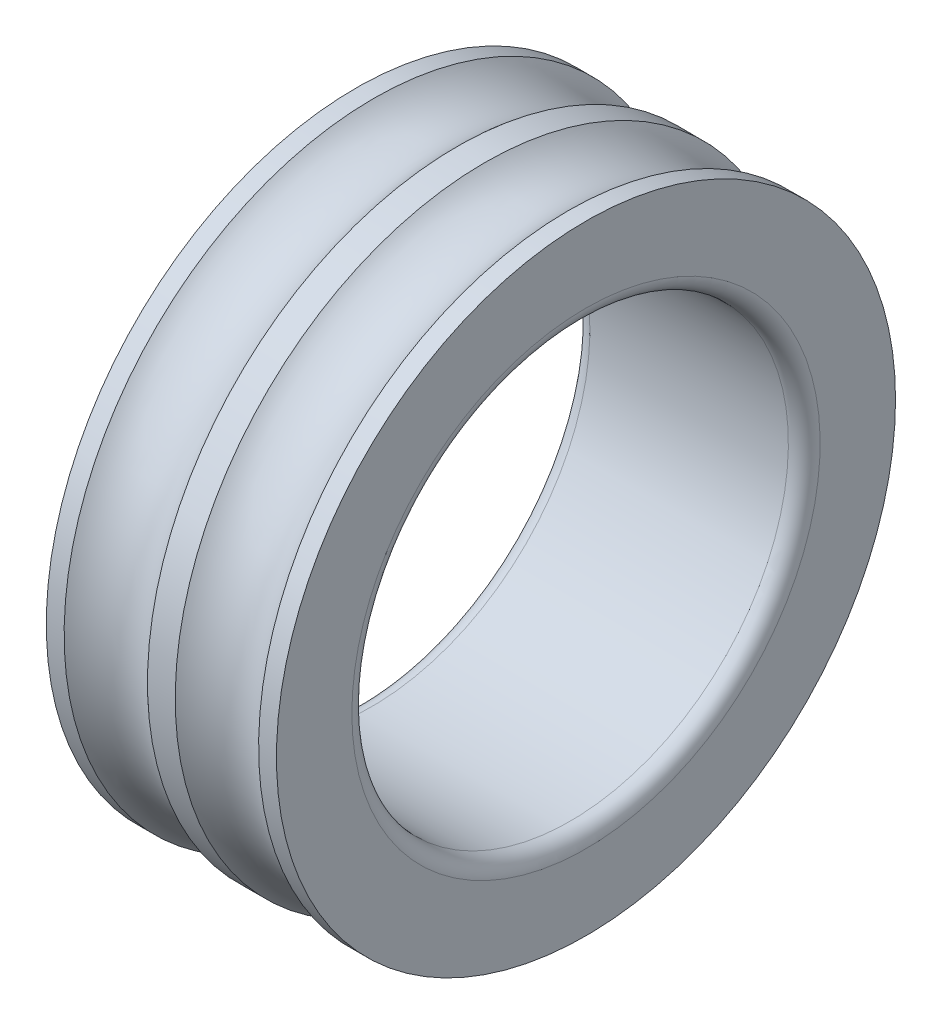
ISO-10303-21;
HEADER;
FILE_DESCRIPTION(('STEP AP214'),'2;1');
FILE_NAME('part.step','',(''),(''),'','','');
FILE_SCHEMA(('AUTOMOTIVE_DESIGN { 1 0 10303 214 1 1 1 1 }'));
ENDSEC;
DATA;
#1=APPLICATION_CONTEXT('core data for automotive mechanical design processes');
#2=APPLICATION_PROTOCOL_DEFINITION('international standard','automotive_design',2000,#1);
#3=PRODUCT_CONTEXT('',#1,'mechanical');
#4=PRODUCT('Part','Part','',(#3));
#5=PRODUCT_RELATED_PRODUCT_CATEGORY('part','',(#4));
#6=PRODUCT_DEFINITION_FORMATION('','',#4);
#7=PRODUCT_DEFINITION_CONTEXT('part definition',#1,'design');
#8=PRODUCT_DEFINITION('design','',#6,#7);
#9=PRODUCT_DEFINITION_SHAPE('','',#8);
#10=(LENGTH_UNIT() NAMED_UNIT(*) SI_UNIT(.MILLI.,.METRE.));
#11=(NAMED_UNIT(*) PLANE_ANGLE_UNIT() SI_UNIT($,.RADIAN.));
#12=(NAMED_UNIT(*) SI_UNIT($,.STERADIAN.) SOLID_ANGLE_UNIT());
#13=UNCERTAINTY_MEASURE_WITH_UNIT(LENGTH_MEASURE(1.E-05),#10,'distance_accuracy_value','');
#14=(GEOMETRIC_REPRESENTATION_CONTEXT(3) GLOBAL_UNCERTAINTY_ASSIGNED_CONTEXT((#13)) GLOBAL_UNIT_ASSIGNED_CONTEXT((#10,
#11,#12)) REPRESENTATION_CONTEXT('',''));
#15=CARTESIAN_POINT('',(0.,0.,0.));
#16=DIRECTION('',(0.,0.,1.));
#17=DIRECTION('',(1.,0.,0.));
#18=AXIS2_PLACEMENT_3D('',#15,#16,#17);
#19=CARTESIAN_POINT('',(2.,0.,0.));
#20=DIRECTION('',(1.,0.,0.));
#21=DIRECTION('',(0.,1.,0.));
#22=AXIS2_PLACEMENT_3D('',#19,#20,#21);
#23=TOROIDAL_SURFACE('',#22,29.5,2.);
#24=CARTESIAN_POINT('',(2.,0.,0.));
#25=DIRECTION('',(-1.,0.,0.));
#26=DIRECTION('',(0.,0.,1.));
#27=AXIS2_PLACEMENT_3D('',#24,#25,#26);
#28=CIRCLE('',#27,27.5);
#29=CARTESIAN_POINT('',(2.,0.,27.5));
#30=VERTEX_POINT('',#29);
#31=EDGE_CURVE('E103',#30,#30,#28,.T.);
#32=ORIENTED_EDGE('',*,*,#31,.F.);
#33=EDGE_LOOP('',(#32));
#34=FACE_BOUND('',#33,.T.);
#35=CARTESIAN_POINT('',(0.,0.,0.));
#36=DIRECTION('',(-1.,0.,0.));
#37=DIRECTION('',(0.,0.,1.));
#38=AXIS2_PLACEMENT_3D('',#35,#36,#37);
#39=CIRCLE('',#38,29.5);
#40=CARTESIAN_POINT('',(0.,0.,29.5));
#41=VERTEX_POINT('',#40);
#42=EDGE_CURVE('E90',#41,#41,#39,.F.);
#43=ORIENTED_EDGE('',*,*,#42,.F.);
#44=EDGE_LOOP('',(#43));
#45=FACE_BOUND('',#44,.T.);
#46=ADVANCED_FACE('F14',(#34,#45),#23,.T.);
#47=CARTESIAN_POINT('',(2.,0.,0.));
#48=DIRECTION('',(1.,0.,0.));
#49=DIRECTION('',(0.,0.,-1.));
#50=AXIS2_PLACEMENT_3D('',#47,#48,#49);
#51=CYLINDRICAL_SURFACE('',#50,27.5);
#52=ORIENTED_EDGE('',*,*,#31,.T.);
#53=EDGE_LOOP('',(#52));
#54=FACE_BOUND('',#53,.T.);
#55=CARTESIAN_POINT('',(27.,0.,0.));
#56=DIRECTION('',(1.,0.,0.));
#57=DIRECTION('',(0.,1.,0.));
#58=AXIS2_PLACEMENT_3D('',#55,#56,#57);
#59=CIRCLE('',#58,27.5);
#60=CARTESIAN_POINT('',(27.,27.5,0.));
#61=VERTEX_POINT('',#60);
#62=EDGE_CURVE('E67',#61,#61,#59,.F.);
#63=ORIENTED_EDGE('',*,*,#62,.F.);
#64=EDGE_LOOP('',(#63));
#65=FACE_BOUND('',#64,.T.);
#66=ADVANCED_FACE('F128',(#54,#65),#51,.F.);
#67=CARTESIAN_POINT('',(0.,0.,34.25));
#68=DIRECTION('',(-1.,0.,0.));
#69=DIRECTION('',(0.,0.,1.));
#70=AXIS2_PLACEMENT_3D('',#67,#68,#69);
#71=PLANE('',#70);
#72=ORIENTED_EDGE('',*,*,#42,.T.);
#73=EDGE_LOOP('',(#72));
#74=FACE_BOUND('',#73,.T.);
#75=CARTESIAN_POINT('',(0.,0.,0.));
#76=DIRECTION('',(1.,0.,0.));
#77=DIRECTION('',(0.,0.,-1.));
#78=AXIS2_PLACEMENT_3D('',#75,#76,#77);
#79=CIRCLE('',#78,39.);
#80=CARTESIAN_POINT('',(0.,0.,-39.));
#81=VERTEX_POINT('',#80);
#82=EDGE_CURVE('E19',#81,#81,#79,.T.);
#83=ORIENTED_EDGE('',*,*,#82,.F.);
#84=EDGE_LOOP('',(#83));
#85=FACE_BOUND('',#84,.T.);
#86=ADVANCED_FACE('F73',(#74,#85),#71,.T.);
#87=CARTESIAN_POINT('',(27.,0.,0.));
#88=DIRECTION('',(1.,0.,0.));
#89=DIRECTION('',(0.,1.,0.));
#90=AXIS2_PLACEMENT_3D('',#87,#88,#89);
#91=TOROIDAL_SURFACE('',#90,29.5,2.);
#92=CARTESIAN_POINT('',(29.,0.,0.));
#93=DIRECTION('',(1.,0.,0.));
#94=DIRECTION('',(0.,0.,1.));
#95=AXIS2_PLACEMENT_3D('',#92,#93,#94);
#96=CIRCLE('',#95,29.5);
#97=CARTESIAN_POINT('',(29.,0.,29.5));
#98=VERTEX_POINT('',#97);
#99=EDGE_CURVE('E102',#98,#98,#96,.F.);
#100=ORIENTED_EDGE('',*,*,#99,.F.);
#101=EDGE_LOOP('',(#100));
#102=FACE_BOUND('',#101,.T.);
#103=ORIENTED_EDGE('',*,*,#62,.T.);
#104=EDGE_LOOP('',(#103));
#105=FACE_BOUND('',#104,.T.);
#106=ADVANCED_FACE('F69',(#102,#105),#91,.T.);
#107=CARTESIAN_POINT('',(1.12415610417338,0.,0.));
#108=DIRECTION('',(1.,0.,0.));
#109=DIRECTION('',(0.,0.,-1.));
#110=AXIS2_PLACEMENT_3D('',#107,#108,#109);
#111=CYLINDRICAL_SURFACE('',#110,39.);
#112=CARTESIAN_POINT('',(2.24831220834676,0.,0.));
#113=DIRECTION('',(1.,0.,0.));
#114=DIRECTION('',(0.,1.,0.));
#115=AXIS2_PLACEMENT_3D('',#112,#113,#114);
#116=CIRCLE('',#115,39.);
#117=CARTESIAN_POINT('',(2.24831220834676,39.,0.));
#118=VERTEX_POINT('',#117);
#119=EDGE_CURVE('E94',#118,#118,#116,.T.);
#120=ORIENTED_EDGE('',*,*,#119,.F.);
#121=EDGE_LOOP('',(#120));
#122=FACE_BOUND('',#121,.T.);
#123=ORIENTED_EDGE('',*,*,#82,.T.);
#124=EDGE_LOOP('',(#123));
#125=FACE_BOUND('',#124,.T.);
#126=ADVANCED_FACE('F52',(#122,#125),#111,.T.);
#127=CARTESIAN_POINT('',(29.,0.,34.25));
#128=DIRECTION('',(1.,0.,0.));
#129=DIRECTION('',(0.,0.,-1.));
#130=AXIS2_PLACEMENT_3D('',#127,#128,#129);
#131=PLANE('',#130);
#132=CARTESIAN_POINT('',(29.,0.,0.));
#133=DIRECTION('',(1.,0.,0.));
#134=DIRECTION('',(0.,0.,-1.));
#135=AXIS2_PLACEMENT_3D('',#132,#133,#134);
#136=CIRCLE('',#135,39.);
#137=CARTESIAN_POINT('',(29.,0.,-39.));
#138=VERTEX_POINT('',#137);
#139=EDGE_CURVE('E35',#138,#138,#136,.F.);
#140=ORIENTED_EDGE('',*,*,#139,.F.);
#141=EDGE_LOOP('',(#140));
#142=FACE_BOUND('',#141,.T.);
#143=ORIENTED_EDGE('',*,*,#99,.T.);
#144=EDGE_LOOP('',(#143));
#145=FACE_BOUND('',#144,.T.);
#146=ADVANCED_FACE('F46',(#142,#145),#131,.T.);
#147=CARTESIAN_POINT('',(7.50000000000001,0.,0.));
#148=DIRECTION('',(1.,0.,0.));
#149=DIRECTION('',(0.,1.,0.));
#150=AXIS2_PLACEMENT_3D('',#147,#148,#149);
#151=TOROIDAL_SURFACE('',#150,44.4109995,7.54050000000002);
#152=ORIENTED_EDGE('',*,*,#119,.T.);
#153=EDGE_LOOP('',(#152));
#154=FACE_BOUND('',#153,.T.);
#155=CARTESIAN_POINT('',(12.7516877916532,0.,0.));
#156=DIRECTION('',(1.,0.,0.));
#157=DIRECTION('',(0.,0.,-1.));
#158=AXIS2_PLACEMENT_3D('',#155,#156,#157);
#159=CIRCLE('',#158,39.);
#160=CARTESIAN_POINT('',(12.7516877916532,0.,-39.));
#161=VERTEX_POINT('',#160);
#162=EDGE_CURVE('E28',#161,#161,#159,.T.);
#163=ORIENTED_EDGE('',*,*,#162,.F.);
#164=EDGE_LOOP('',(#163));
#165=FACE_BOUND('',#164,.T.);
#166=ADVANCED_FACE('F41',(#154,#165),#151,.F.);
#167=CARTESIAN_POINT('',(27.8758438958266,0.,0.));
#168=DIRECTION('',(1.,0.,0.));
#169=DIRECTION('',(0.,0.,-1.));
#170=AXIS2_PLACEMENT_3D('',#167,#168,#169);
#171=CYLINDRICAL_SURFACE('',#170,39.);
#172=ORIENTED_EDGE('',*,*,#139,.T.);
#173=EDGE_LOOP('',(#172));
#174=FACE_BOUND('',#173,.T.);
#175=CARTESIAN_POINT('',(26.7516877916532,0.,0.));
#176=DIRECTION('',(1.,0.,0.));
#177=DIRECTION('',(0.,1.,0.));
#178=AXIS2_PLACEMENT_3D('',#175,#176,#177);
#179=CIRCLE('',#178,39.);
#180=CARTESIAN_POINT('',(26.7516877916532,39.,0.));
#181=VERTEX_POINT('',#180);
#182=EDGE_CURVE('E23',#181,#181,#179,.F.);
#183=ORIENTED_EDGE('',*,*,#182,.F.);
#184=EDGE_LOOP('',(#183));
#185=FACE_BOUND('',#184,.T.);
#186=ADVANCED_FACE('F45',(#174,#185),#171,.T.);
#187=CARTESIAN_POINT('',(14.5,0.,0.));
#188=DIRECTION('',(1.,0.,0.));
#189=DIRECTION('',(0.,0.,-1.));
#190=AXIS2_PLACEMENT_3D('',#187,#188,#189);
#191=CYLINDRICAL_SURFACE('',#190,39.);
#192=CARTESIAN_POINT('',(16.2483122083468,0.,0.));
#193=DIRECTION('',(1.,0.,0.));
#194=DIRECTION('',(0.,1.,0.));
#195=AXIS2_PLACEMENT_3D('',#192,#193,#194);
#196=CIRCLE('',#195,39.);
#197=CARTESIAN_POINT('',(16.2483122083468,39.,0.));
#198=VERTEX_POINT('',#197);
#199=EDGE_CURVE('E10',#198,#198,#196,.T.);
#200=ORIENTED_EDGE('',*,*,#199,.F.);
#201=EDGE_LOOP('',(#200));
#202=FACE_BOUND('',#201,.T.);
#203=ORIENTED_EDGE('',*,*,#162,.T.);
#204=EDGE_LOOP('',(#203));
#205=FACE_BOUND('',#204,.T.);
#206=ADVANCED_FACE('F139',(#202,#205),#191,.T.);
#207=CARTESIAN_POINT('',(21.5,0.,0.));
#208=DIRECTION('',(1.,0.,0.));
#209=DIRECTION('',(0.,1.,0.));
#210=AXIS2_PLACEMENT_3D('',#207,#208,#209);
#211=TOROIDAL_SURFACE('',#210,44.4109995,7.54050000000002);
#212=ORIENTED_EDGE('',*,*,#199,.T.);
#213=EDGE_LOOP('',(#212));
#214=FACE_BOUND('',#213,.T.);
#215=ORIENTED_EDGE('',*,*,#182,.T.);
#216=EDGE_LOOP('',(#215));
#217=FACE_BOUND('',#216,.T.);
#218=ADVANCED_FACE('F137',(#214,#217),#211,.F.);
#219=CLOSED_SHELL('',(#46,#66,#86,#106,#126,#146,#166,#186,#206,#218));
#220=MANIFOLD_SOLID_BREP('B1',#219);
#221=ADVANCED_BREP_SHAPE_REPRESENTATION('',(#18,#220),#14);
#222=SHAPE_DEFINITION_REPRESENTATION(#9,#221);
ENDSEC;
END-ISO-10303-21;
